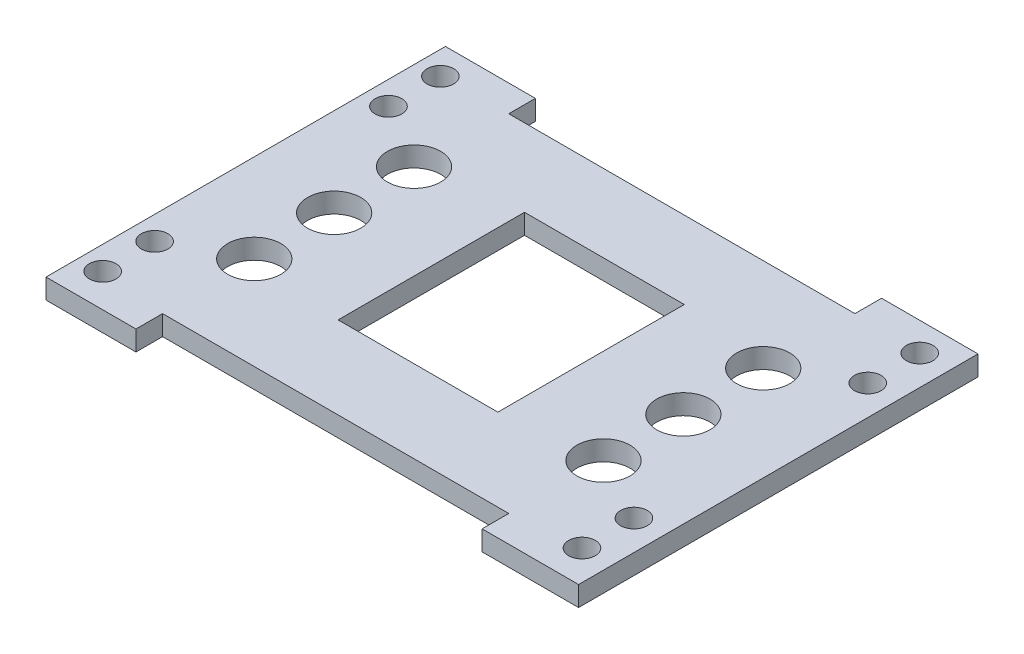
ISO-10303-21;
HEADER;
FILE_DESCRIPTION(('STEP AP214'),'2;1');
FILE_NAME('part.step','',(''),(''),'','','');
FILE_SCHEMA(('AUTOMOTIVE_DESIGN { 1 0 10303 214 1 1 1 1 }'));
ENDSEC;
DATA;
#1=APPLICATION_CONTEXT('core data for automotive mechanical design processes');
#2=APPLICATION_PROTOCOL_DEFINITION('international standard','automotive_design',2000,#1);
#3=PRODUCT_CONTEXT('',#1,'mechanical');
#4=PRODUCT('Part','Part','',(#3));
#5=PRODUCT_RELATED_PRODUCT_CATEGORY('part','',(#4));
#6=PRODUCT_DEFINITION_FORMATION('','',#4);
#7=PRODUCT_DEFINITION_CONTEXT('part definition',#1,'design');
#8=PRODUCT_DEFINITION('design','',#6,#7);
#9=PRODUCT_DEFINITION_SHAPE('','',#8);
#10=(LENGTH_UNIT() NAMED_UNIT(*) SI_UNIT(.MILLI.,.METRE.));
#11=(NAMED_UNIT(*) PLANE_ANGLE_UNIT() SI_UNIT($,.RADIAN.));
#12=(NAMED_UNIT(*) SI_UNIT($,.STERADIAN.) SOLID_ANGLE_UNIT());
#13=UNCERTAINTY_MEASURE_WITH_UNIT(LENGTH_MEASURE(1.E-05),#10,'distance_accuracy_value','');
#14=(GEOMETRIC_REPRESENTATION_CONTEXT(3) GLOBAL_UNCERTAINTY_ASSIGNED_CONTEXT((#13)) GLOBAL_UNIT_ASSIGNED_CONTEXT((#10,
#11,#12)) REPRESENTATION_CONTEXT('',''));
#15=CARTESIAN_POINT('',(0.,0.,0.));
#16=DIRECTION('',(0.,0.,1.));
#17=DIRECTION('',(1.,0.,0.));
#18=AXIS2_PLACEMENT_3D('',#15,#16,#17);
#19=CARTESIAN_POINT('',(-13.,1.5,0.));
#20=DIRECTION('',(1.,0.,0.));
#21=DIRECTION('',(0.,0.,-1.));
#22=AXIS2_PLACEMENT_3D('',#19,#20,#21);
#23=PLANE('',#22);
#24=DIRECTION('',(0.,0.,1.));
#25=VECTOR('',#24,1.);
#26=CARTESIAN_POINT('',(-13.,0.,0.));
#27=LINE('',#26,#25);
#28=CARTESIAN_POINT('',(-13.,0.,-14.8173161636122));
#29=VERTEX_POINT('',#28);
#30=CARTESIAN_POINT('',(-13.,0.,-12.8173161636123));
#31=VERTEX_POINT('',#30);
#32=EDGE_CURVE('E274',#29,#31,#27,.T.);
#33=ORIENTED_EDGE('',*,*,#32,.F.);
#34=DIRECTION('',(0.,-1.,0.));
#35=VECTOR('',#34,1.);
#36=CARTESIAN_POINT('',(-13.,1.5,-14.8173161636122));
#37=LINE('',#36,#35);
#38=CARTESIAN_POINT('',(-13.,1.5,-14.8173161636122));
#39=VERTEX_POINT('',#38);
#40=EDGE_CURVE('E11',#39,#29,#37,.T.);
#41=ORIENTED_EDGE('',*,*,#40,.F.);
#42=DIRECTION('',(0.,0.,1.));
#43=VECTOR('',#42,1.);
#44=CARTESIAN_POINT('',(-13.,1.5,0.));
#45=LINE('',#44,#43);
#46=CARTESIAN_POINT('',(-13.,1.5,-12.8173161636123));
#47=VERTEX_POINT('',#46);
#48=EDGE_CURVE('E186',#39,#47,#45,.T.);
#49=ORIENTED_EDGE('',*,*,#48,.T.);
#50=DIRECTION('',(0.,-1.,0.));
#51=VECTOR('',#50,1.);
#52=CARTESIAN_POINT('',(-13.,1.5,-12.8173161636123));
#53=LINE('',#52,#51);
#54=EDGE_CURVE('E52',#47,#31,#53,.T.);
#55=ORIENTED_EDGE('',*,*,#54,.T.);
#56=EDGE_LOOP('',(#33,#41,#49,#55));
#57=FACE_BOUND('',#56,.T.);
#58=ADVANCED_FACE('F33',(#57),#23,.T.);
#59=CARTESIAN_POINT('',(0.,1.5,-14.8173161636122));
#60=DIRECTION('',(0.,0.,-1.));
#61=DIRECTION('',(-1.,0.,0.));
#62=AXIS2_PLACEMENT_3D('',#59,#60,#61);
#63=PLANE('',#62);
#64=DIRECTION('',(1.,0.,0.));
#65=VECTOR('',#64,1.);
#66=CARTESIAN_POINT('',(0.,0.,-14.8173161636122));
#67=LINE('',#66,#65);
#68=CARTESIAN_POINT('',(-19.756421551483,0.,-14.8173161636122));
#69=VERTEX_POINT('',#68);
#70=EDGE_CURVE('E276',#69,#29,#67,.T.);
#71=ORIENTED_EDGE('',*,*,#70,.F.);
#72=DIRECTION('',(0.,-1.,0.));
#73=VECTOR('',#72,1.);
#74=CARTESIAN_POINT('',(-19.756421551483,1.5,-14.8173161636122));
#75=LINE('',#74,#73);
#76=CARTESIAN_POINT('',(-19.756421551483,1.5,-14.8173161636122));
#77=VERTEX_POINT('',#76);
#78=EDGE_CURVE('E43',#77,#69,#75,.T.);
#79=ORIENTED_EDGE('',*,*,#78,.F.);
#80=DIRECTION('',(1.,0.,0.));
#81=VECTOR('',#80,1.);
#82=CARTESIAN_POINT('',(0.,1.5,-14.8173161636122));
#83=LINE('',#82,#81);
#84=EDGE_CURVE('E179',#77,#39,#83,.T.);
#85=ORIENTED_EDGE('',*,*,#84,.T.);
#86=ORIENTED_EDGE('',*,*,#40,.T.);
#87=EDGE_LOOP('',(#71,#79,#85,#86));
#88=FACE_BOUND('',#87,.T.);
#89=ADVANCED_FACE('F350',(#88),#63,.T.);
#90=CARTESIAN_POINT('',(-19.756421551483,1.5,0.));
#91=DIRECTION('',(1.,0.,0.));
#92=DIRECTION('',(0.,0.,-1.));
#93=AXIS2_PLACEMENT_3D('',#90,#91,#92);
#94=PLANE('',#93);
#95=DIRECTION('',(0.,0.,1.));
#96=VECTOR('',#95,1.);
#97=CARTESIAN_POINT('',(-19.756421551483,0.,0.));
#98=LINE('',#97,#96);
#99=CARTESIAN_POINT('',(-19.756421551483,0.,15.1826838363877));
#100=VERTEX_POINT('',#99);
#101=EDGE_CURVE('E279',#69,#100,#98,.T.);
#102=ORIENTED_EDGE('',*,*,#101,.T.);
#103=DIRECTION('',(0.,-1.,0.));
#104=VECTOR('',#103,1.);
#105=CARTESIAN_POINT('',(-19.756421551483,1.5,15.1826838363877));
#106=LINE('',#105,#104);
#107=CARTESIAN_POINT('',(-19.756421551483,1.5,15.1826838363877));
#108=VERTEX_POINT('',#107);
#109=EDGE_CURVE('E237',#108,#100,#106,.T.);
#110=ORIENTED_EDGE('',*,*,#109,.F.);
#111=DIRECTION('',(0.,0.,1.));
#112=VECTOR('',#111,1.);
#113=CARTESIAN_POINT('',(-19.756421551483,1.5,0.));
#114=LINE('',#113,#112);
#115=EDGE_CURVE('E185',#77,#108,#114,.T.);
#116=ORIENTED_EDGE('',*,*,#115,.F.);
#117=ORIENTED_EDGE('',*,*,#78,.T.);
#118=EDGE_LOOP('',(#102,#110,#116,#117));
#119=FACE_BOUND('',#118,.T.);
#120=ADVANCED_FACE('F355',(#119),#94,.F.);
#121=CARTESIAN_POINT('',(0.,1.5,15.1826838363877));
#122=DIRECTION('',(0.,0.,-1.));
#123=DIRECTION('',(-1.,0.,0.));
#124=AXIS2_PLACEMENT_3D('',#121,#122,#123);
#125=PLANE('',#124);
#126=DIRECTION('',(1.,0.,0.));
#127=VECTOR('',#126,1.);
#128=CARTESIAN_POINT('',(0.,0.,15.1826838363877));
#129=LINE('',#128,#127);
#130=CARTESIAN_POINT('',(-13.,0.,15.1826838363877));
#131=VERTEX_POINT('',#130);
#132=EDGE_CURVE('E282',#100,#131,#129,.T.);
#133=ORIENTED_EDGE('',*,*,#132,.T.);
#134=DIRECTION('',(0.,-1.,0.));
#135=VECTOR('',#134,1.);
#136=CARTESIAN_POINT('',(-13.,1.5,15.1826838363877));
#137=LINE('',#136,#135);
#138=CARTESIAN_POINT('',(-13.,1.5,15.1826838363877));
#139=VERTEX_POINT('',#138);
#140=EDGE_CURVE('E234',#139,#131,#137,.T.);
#141=ORIENTED_EDGE('',*,*,#140,.F.);
#142=DIRECTION('',(1.,0.,0.));
#143=VECTOR('',#142,1.);
#144=CARTESIAN_POINT('',(0.,1.5,15.1826838363877));
#145=LINE('',#144,#143);
#146=EDGE_CURVE('E190',#108,#139,#145,.T.);
#147=ORIENTED_EDGE('',*,*,#146,.F.);
#148=ORIENTED_EDGE('',*,*,#109,.T.);
#149=EDGE_LOOP('',(#133,#141,#147,#148));
#150=FACE_BOUND('',#149,.T.);
#151=ADVANCED_FACE('F464',(#150),#125,.F.);
#152=CARTESIAN_POINT('',(-13.,1.5,0.));
#153=DIRECTION('',(-1.,0.,0.));
#154=DIRECTION('',(0.,0.,1.));
#155=AXIS2_PLACEMENT_3D('',#152,#153,#154);
#156=PLANE('',#155);
#157=DIRECTION('',(0.,0.,-1.));
#158=VECTOR('',#157,1.);
#159=CARTESIAN_POINT('',(-13.,0.,0.));
#160=LINE('',#159,#158);
#161=CARTESIAN_POINT('',(-13.,0.,13.1826838363877));
#162=VERTEX_POINT('',#161);
#163=EDGE_CURVE('E285',#131,#162,#160,.T.);
#164=ORIENTED_EDGE('',*,*,#163,.T.);
#165=DIRECTION('',(0.,-1.,0.));
#166=VECTOR('',#165,1.);
#167=CARTESIAN_POINT('',(-13.,1.5,13.1826838363877));
#168=LINE('',#167,#166);
#169=CARTESIAN_POINT('',(-13.,1.5,13.1826838363877));
#170=VERTEX_POINT('',#169);
#171=EDGE_CURVE('E231',#170,#162,#168,.T.);
#172=ORIENTED_EDGE('',*,*,#171,.F.);
#173=DIRECTION('',(0.,0.,-1.));
#174=VECTOR('',#173,1.);
#175=CARTESIAN_POINT('',(-13.,1.5,0.));
#176=LINE('',#175,#174);
#177=EDGE_CURVE('E428',#139,#170,#176,.T.);
#178=ORIENTED_EDGE('',*,*,#177,.F.);
#179=ORIENTED_EDGE('',*,*,#140,.T.);
#180=EDGE_LOOP('',(#164,#172,#178,#179));
#181=FACE_BOUND('',#180,.T.);
#182=ADVANCED_FACE('F470',(#181),#156,.F.);
#183=CARTESIAN_POINT('',(0.,1.5,13.1826838363877));
#184=DIRECTION('',(0.,0.,-1.));
#185=DIRECTION('',(-1.,0.,0.));
#186=AXIS2_PLACEMENT_3D('',#183,#184,#185);
#187=PLANE('',#186);
#188=DIRECTION('',(1.,0.,0.));
#189=VECTOR('',#188,1.);
#190=CARTESIAN_POINT('',(0.,0.,13.1826838363877));
#191=LINE('',#190,#189);
#192=CARTESIAN_POINT('',(13.,0.,13.1826838363877));
#193=VERTEX_POINT('',#192);
#194=EDGE_CURVE('E289',#162,#193,#191,.T.);
#195=ORIENTED_EDGE('',*,*,#194,.T.);
#196=DIRECTION('',(0.,-1.,0.));
#197=VECTOR('',#196,1.);
#198=CARTESIAN_POINT('',(13.,1.5,13.1826838363877));
#199=LINE('',#198,#197);
#200=CARTESIAN_POINT('',(13.,1.5,13.1826838363877));
#201=VERTEX_POINT('',#200);
#202=EDGE_CURVE('E229',#201,#193,#199,.T.);
#203=ORIENTED_EDGE('',*,*,#202,.F.);
#204=DIRECTION('',(1.,0.,0.));
#205=VECTOR('',#204,1.);
#206=CARTESIAN_POINT('',(0.,1.5,13.1826838363877));
#207=LINE('',#206,#205);
#208=EDGE_CURVE('E426',#170,#201,#207,.T.);
#209=ORIENTED_EDGE('',*,*,#208,.F.);
#210=ORIENTED_EDGE('',*,*,#171,.T.);
#211=EDGE_LOOP('',(#195,#203,#209,#210));
#212=FACE_BOUND('',#211,.T.);
#213=ADVANCED_FACE('F467',(#212),#187,.F.);
#214=CARTESIAN_POINT('',(13.,1.5,0.));
#215=DIRECTION('',(-1.,0.,0.));
#216=DIRECTION('',(0.,0.,1.));
#217=AXIS2_PLACEMENT_3D('',#214,#215,#216);
#218=PLANE('',#217);
#219=DIRECTION('',(0.,0.,-1.));
#220=VECTOR('',#219,1.);
#221=CARTESIAN_POINT('',(13.,0.,0.));
#222=LINE('',#221,#220);
#223=CARTESIAN_POINT('',(13.,0.,15.1826838363877));
#224=VERTEX_POINT('',#223);
#225=EDGE_CURVE('E292',#224,#193,#222,.T.);
#226=ORIENTED_EDGE('',*,*,#225,.F.);
#227=DIRECTION('',(0.,-1.,0.));
#228=VECTOR('',#227,1.);
#229=CARTESIAN_POINT('',(13.,1.5,15.1826838363877));
#230=LINE('',#229,#228);
#231=CARTESIAN_POINT('',(13.,1.5,15.1826838363877));
#232=VERTEX_POINT('',#231);
#233=EDGE_CURVE('E227',#232,#224,#230,.T.);
#234=ORIENTED_EDGE('',*,*,#233,.F.);
#235=DIRECTION('',(0.,0.,-1.));
#236=VECTOR('',#235,1.);
#237=CARTESIAN_POINT('',(13.,1.5,0.));
#238=LINE('',#237,#236);
#239=EDGE_CURVE('E423',#232,#201,#238,.T.);
#240=ORIENTED_EDGE('',*,*,#239,.T.);
#241=ORIENTED_EDGE('',*,*,#202,.T.);
#242=EDGE_LOOP('',(#226,#234,#240,#241));
#243=FACE_BOUND('',#242,.T.);
#244=ADVANCED_FACE('F463',(#243),#218,.T.);
#245=CARTESIAN_POINT('',(20.243578448517,0.,15.1826838363877));
#246=VERTEX_POINT('',#245);
#247=EDGE_CURVE('E286',#224,#246,#129,.T.);
#248=ORIENTED_EDGE('',*,*,#247,.T.);
#249=DIRECTION('',(0.,-1.,0.));
#250=VECTOR('',#249,1.);
#251=CARTESIAN_POINT('',(20.243578448517,1.5,15.1826838363877));
#252=LINE('',#251,#250);
#253=CARTESIAN_POINT('',(20.243578448517,1.5,15.1826838363877));
#254=VERTEX_POINT('',#253);
#255=EDGE_CURVE('E225',#254,#246,#252,.T.);
#256=ORIENTED_EDGE('',*,*,#255,.F.);
#257=EDGE_CURVE('E180',#232,#254,#145,.T.);
#258=ORIENTED_EDGE('',*,*,#257,.F.);
#259=ORIENTED_EDGE('',*,*,#233,.T.);
#260=EDGE_LOOP('',(#248,#256,#258,#259));
#261=FACE_BOUND('',#260,.T.);
#262=ADVANCED_FACE('F438',(#261),#125,.F.);
#263=CARTESIAN_POINT('',(20.243578448517,1.5,0.));
#264=DIRECTION('',(1.,0.,0.));
#265=DIRECTION('',(0.,0.,-1.));
#266=AXIS2_PLACEMENT_3D('',#263,#264,#265);
#267=PLANE('',#266);
#268=DIRECTION('',(0.,0.,1.));
#269=VECTOR('',#268,1.);
#270=CARTESIAN_POINT('',(20.243578448517,0.,0.));
#271=LINE('',#270,#269);
#272=CARTESIAN_POINT('',(20.243578448517,0.,-14.8173161636122));
#273=VERTEX_POINT('',#272);
#274=EDGE_CURVE('E295',#273,#246,#271,.T.);
#275=ORIENTED_EDGE('',*,*,#274,.F.);
#276=DIRECTION('',(0.,-1.,0.));
#277=VECTOR('',#276,1.);
#278=CARTESIAN_POINT('',(20.243578448517,1.5,-14.8173161636122));
#279=LINE('',#278,#277);
#280=CARTESIAN_POINT('',(20.243578448517,1.5,-14.8173161636122));
#281=VERTEX_POINT('',#280);
#282=EDGE_CURVE('E164',#281,#273,#279,.T.);
#283=ORIENTED_EDGE('',*,*,#282,.F.);
#284=DIRECTION('',(0.,0.,1.));
#285=VECTOR('',#284,1.);
#286=CARTESIAN_POINT('',(20.243578448517,1.5,0.));
#287=LINE('',#286,#285);
#288=EDGE_CURVE('E177',#281,#254,#287,.T.);
#289=ORIENTED_EDGE('',*,*,#288,.T.);
#290=ORIENTED_EDGE('',*,*,#255,.T.);
#291=EDGE_LOOP('',(#275,#283,#289,#290));
#292=FACE_BOUND('',#291,.T.);
#293=ADVANCED_FACE('F442',(#292),#267,.T.);
#294=CARTESIAN_POINT('',(13.,0.,-14.8173161636122));
#295=VERTEX_POINT('',#294);
#296=EDGE_CURVE('E161',#295,#273,#67,.T.);
#297=ORIENTED_EDGE('',*,*,#296,.F.);
#298=DIRECTION('',(0.,-1.,0.));
#299=VECTOR('',#298,1.);
#300=CARTESIAN_POINT('',(13.,1.5,-14.8173161636122));
#301=LINE('',#300,#299);
#302=CARTESIAN_POINT('',(13.,1.5,-14.8173161636122));
#303=VERTEX_POINT('',#302);
#304=EDGE_CURVE('E155',#303,#295,#301,.T.);
#305=ORIENTED_EDGE('',*,*,#304,.F.);
#306=EDGE_CURVE('E159',#303,#281,#83,.T.);
#307=ORIENTED_EDGE('',*,*,#306,.T.);
#308=ORIENTED_EDGE('',*,*,#282,.T.);
#309=EDGE_LOOP('',(#297,#305,#307,#308));
#310=FACE_BOUND('',#309,.T.);
#311=ADVANCED_FACE('F157',(#310),#63,.T.);
#312=CARTESIAN_POINT('',(13.,1.5,0.));
#313=DIRECTION('',(1.,0.,0.));
#314=DIRECTION('',(0.,0.,-1.));
#315=AXIS2_PLACEMENT_3D('',#312,#313,#314);
#316=PLANE('',#315);
#317=DIRECTION('',(0.,0.,1.));
#318=VECTOR('',#317,1.);
#319=CARTESIAN_POINT('',(13.,0.,0.));
#320=LINE('',#319,#318);
#321=CARTESIAN_POINT('',(13.,0.,-12.8173161636123));
#322=VERTEX_POINT('',#321);
#323=EDGE_CURVE('E298',#295,#322,#320,.T.);
#324=ORIENTED_EDGE('',*,*,#323,.T.);
#325=DIRECTION('',(0.,-1.,0.));
#326=VECTOR('',#325,1.);
#327=CARTESIAN_POINT('',(13.,1.5,-12.8173161636123));
#328=LINE('',#327,#326);
#329=CARTESIAN_POINT('',(13.,1.5,-12.8173161636123));
#330=VERTEX_POINT('',#329);
#331=EDGE_CURVE('E102',#330,#322,#328,.T.);
#332=ORIENTED_EDGE('',*,*,#331,.F.);
#333=DIRECTION('',(0.,0.,1.));
#334=VECTOR('',#333,1.);
#335=CARTESIAN_POINT('',(13.,1.5,0.));
#336=LINE('',#335,#334);
#337=EDGE_CURVE('E166',#303,#330,#336,.T.);
#338=ORIENTED_EDGE('',*,*,#337,.F.);
#339=ORIENTED_EDGE('',*,*,#304,.T.);
#340=EDGE_LOOP('',(#324,#332,#338,#339));
#341=FACE_BOUND('',#340,.T.);
#342=ADVANCED_FACE('F167',(#341),#316,.F.);
#343=CARTESIAN_POINT('',(0.,1.5,-7.));
#344=DIRECTION('',(0.,0.,-1.));
#345=DIRECTION('',(-1.,0.,0.));
#346=AXIS2_PLACEMENT_3D('',#343,#344,#345);
#347=PLANE('',#346);
#348=DIRECTION('',(1.,0.,0.));
#349=VECTOR('',#348,1.);
#350=CARTESIAN_POINT('',(0.,0.,-7.));
#351=LINE('',#350,#349);
#352=CARTESIAN_POINT('',(-6.,0.,-7.));
#353=VERTEX_POINT('',#352);
#354=CARTESIAN_POINT('',(6.,0.,-7.));
#355=VERTEX_POINT('',#354);
#356=EDGE_CURVE('E257',#353,#355,#351,.T.);
#357=ORIENTED_EDGE('',*,*,#356,.T.);
#358=DIRECTION('',(0.,-1.,0.));
#359=VECTOR('',#358,1.);
#360=CARTESIAN_POINT('',(6.,1.5,-7.));
#361=LINE('',#360,#359);
#362=CARTESIAN_POINT('',(6.,1.5,-7.));
#363=VERTEX_POINT('',#362);
#364=EDGE_CURVE('E37',#363,#355,#361,.T.);
#365=ORIENTED_EDGE('',*,*,#364,.F.);
#366=DIRECTION('',(1.,0.,0.));
#367=VECTOR('',#366,1.);
#368=CARTESIAN_POINT('',(0.,1.5,-7.));
#369=LINE('',#368,#367);
#370=CARTESIAN_POINT('',(-6.,1.5,-7.));
#371=VERTEX_POINT('',#370);
#372=EDGE_CURVE('E199',#371,#363,#369,.T.);
#373=ORIENTED_EDGE('',*,*,#372,.F.);
#374=DIRECTION('',(0.,-1.,0.));
#375=VECTOR('',#374,1.);
#376=CARTESIAN_POINT('',(-6.,1.5,-7.));
#377=LINE('',#376,#375);
#378=EDGE_CURVE('E241',#371,#353,#377,.T.);
#379=ORIENTED_EDGE('',*,*,#378,.T.);
#380=EDGE_LOOP('',(#357,#365,#373,#379));
#381=FACE_BOUND('',#380,.T.);
#382=ADVANCED_FACE('F258',(#381),#347,.F.);
#383=CARTESIAN_POINT('',(6.,1.5,0.));
#384=DIRECTION('',(1.,0.,0.));
#385=DIRECTION('',(0.,0.,-1.));
#386=AXIS2_PLACEMENT_3D('',#383,#384,#385);
#387=PLANE('',#386);
#388=DIRECTION('',(0.,0.,1.));
#389=VECTOR('',#388,1.);
#390=CARTESIAN_POINT('',(6.,0.,0.));
#391=LINE('',#390,#389);
#392=CARTESIAN_POINT('',(6.,0.,7.));
#393=VERTEX_POINT('',#392);
#394=EDGE_CURVE('E252',#355,#393,#391,.T.);
#395=ORIENTED_EDGE('',*,*,#394,.T.);
#396=DIRECTION('',(0.,-1.,0.));
#397=VECTOR('',#396,1.);
#398=CARTESIAN_POINT('',(6.,1.5,7.));
#399=LINE('',#398,#397);
#400=CARTESIAN_POINT('',(6.,1.5,7.));
#401=VERTEX_POINT('',#400);
#402=EDGE_CURVE('E245',#401,#393,#399,.T.);
#403=ORIENTED_EDGE('',*,*,#402,.F.);
#404=DIRECTION('',(0.,0.,1.));
#405=VECTOR('',#404,1.);
#406=CARTESIAN_POINT('',(6.,1.5,0.));
#407=LINE('',#406,#405);
#408=EDGE_CURVE('E115',#363,#401,#407,.T.);
#409=ORIENTED_EDGE('',*,*,#408,.F.);
#410=ORIENTED_EDGE('',*,*,#364,.T.);
#411=EDGE_LOOP('',(#395,#403,#409,#410));
#412=FACE_BOUND('',#411,.T.);
#413=ADVANCED_FACE('F251',(#412),#387,.F.);
#414=CARTESIAN_POINT('',(0.,1.5,7.));
#415=DIRECTION('',(0.,0.,-1.));
#416=DIRECTION('',(-1.,0.,0.));
#417=AXIS2_PLACEMENT_3D('',#414,#415,#416);
#418=PLANE('',#417);
#419=DIRECTION('',(1.,0.,0.));
#420=VECTOR('',#419,1.);
#421=CARTESIAN_POINT('',(0.,0.,7.));
#422=LINE('',#421,#420);
#423=CARTESIAN_POINT('',(-6.,0.,7.));
#424=VERTEX_POINT('',#423);
#425=EDGE_CURVE('E264',#424,#393,#422,.T.);
#426=ORIENTED_EDGE('',*,*,#425,.F.);
#427=DIRECTION('',(0.,-1.,0.));
#428=VECTOR('',#427,1.);
#429=CARTESIAN_POINT('',(-6.,1.5,7.));
#430=LINE('',#429,#428);
#431=CARTESIAN_POINT('',(-6.,1.5,7.));
#432=VERTEX_POINT('',#431);
#433=EDGE_CURVE('E243',#432,#424,#430,.T.);
#434=ORIENTED_EDGE('',*,*,#433,.F.);
#435=DIRECTION('',(1.,0.,0.));
#436=VECTOR('',#435,1.);
#437=CARTESIAN_POINT('',(0.,1.5,7.));
#438=LINE('',#437,#436);
#439=EDGE_CURVE('E193',#432,#401,#438,.T.);
#440=ORIENTED_EDGE('',*,*,#439,.T.);
#441=ORIENTED_EDGE('',*,*,#402,.T.);
#442=EDGE_LOOP('',(#426,#434,#440,#441));
#443=FACE_BOUND('',#442,.T.);
#444=ADVANCED_FACE('F345',(#443),#418,.T.);
#445=CARTESIAN_POINT('',(13.1132730822492,1.5,6.18268383638775));
#446=DIRECTION('',(0.,-1.,0.));
#447=DIRECTION('',(0.,0.,-1.));
#448=AXIS2_PLACEMENT_3D('',#445,#446,#447);
#449=CYLINDRICAL_SURFACE('',#448,2.);
#450=CARTESIAN_POINT('',(13.1132730822492,1.5,6.18268383638775));
#451=DIRECTION('',(0.,1.,0.));
#452=DIRECTION('',(0.,0.,1.));
#453=AXIS2_PLACEMENT_3D('',#450,#451,#452);
#454=CIRCLE('',#453,2.);
#455=CARTESIAN_POINT('',(13.1132730822492,1.5,8.18268383638775));
#456=VERTEX_POINT('',#455);
#457=EDGE_CURVE('E393',#456,#456,#454,.F.);
#458=ORIENTED_EDGE('',*,*,#457,.F.);
#459=EDGE_LOOP('',(#458));
#460=FACE_BOUND('',#459,.T.);
#461=CARTESIAN_POINT('',(13.1132730822492,0.,6.18268383638775));
#462=DIRECTION('',(0.,1.,0.));
#463=DIRECTION('',(0.,0.,1.));
#464=AXIS2_PLACEMENT_3D('',#461,#462,#463);
#465=CIRCLE('',#464,2.);
#466=CARTESIAN_POINT('',(13.1132730822492,0.,8.18268383638775));
#467=VERTEX_POINT('',#466);
#468=EDGE_CURVE('E213',#467,#467,#465,.F.);
#469=ORIENTED_EDGE('',*,*,#468,.T.);
#470=EDGE_LOOP('',(#469));
#471=FACE_BOUND('',#470,.T.);
#472=ADVANCED_FACE('F335',(#460,#471),#449,.F.);
#473=CARTESIAN_POINT('',(18.,1.5,-12.6826838363877));
#474=DIRECTION('',(0.,-1.,0.));
#475=DIRECTION('',(0.,0.,-1.));
#476=AXIS2_PLACEMENT_3D('',#473,#474,#475);
#477=CYLINDRICAL_SURFACE('',#476,1.);
#478=CARTESIAN_POINT('',(18.,1.5,-12.6826838363877));
#479=DIRECTION('',(0.,1.,0.));
#480=DIRECTION('',(0.,0.,1.));
#481=AXIS2_PLACEMENT_3D('',#478,#479,#480);
#482=CIRCLE('',#481,1.);
#483=CARTESIAN_POINT('',(18.,1.5,-11.6826838363877));
#484=VERTEX_POINT('',#483);
#485=EDGE_CURVE('E396',#484,#484,#482,.T.);
#486=ORIENTED_EDGE('',*,*,#485,.T.);
#487=EDGE_LOOP('',(#486));
#488=FACE_BOUND('',#487,.T.);
#489=CARTESIAN_POINT('',(18.,0.,-12.6826838363877));
#490=DIRECTION('',(0.,1.,0.));
#491=DIRECTION('',(0.,0.,1.));
#492=AXIS2_PLACEMENT_3D('',#489,#490,#491);
#493=CIRCLE('',#492,1.);
#494=CARTESIAN_POINT('',(18.,0.,-11.6826838363877));
#495=VERTEX_POINT('',#494);
#496=EDGE_CURVE('E218',#495,#495,#493,.T.);
#497=ORIENTED_EDGE('',*,*,#496,.F.);
#498=EDGE_LOOP('',(#497));
#499=FACE_BOUND('',#498,.T.);
#500=ADVANCED_FACE('F332',(#488,#499),#477,.F.);
#501=CARTESIAN_POINT('',(18.,1.5,-8.78268383638775));
#502=DIRECTION('',(0.,-1.,0.));
#503=DIRECTION('',(0.,0.,-1.));
#504=AXIS2_PLACEMENT_3D('',#501,#502,#503);
#505=CYLINDRICAL_SURFACE('',#504,1.);
#506=CARTESIAN_POINT('',(18.,1.5,-8.78268383638775));
#507=DIRECTION('',(0.,1.,0.));
#508=DIRECTION('',(0.,0.,1.));
#509=AXIS2_PLACEMENT_3D('',#506,#507,#508);
#510=CIRCLE('',#509,1.);
#511=CARTESIAN_POINT('',(18.,1.5,-7.78268383638775));
#512=VERTEX_POINT('',#511);
#513=EDGE_CURVE('E398',#512,#512,#510,.T.);
#514=ORIENTED_EDGE('',*,*,#513,.T.);
#515=EDGE_LOOP('',(#514));
#516=FACE_BOUND('',#515,.T.);
#517=CARTESIAN_POINT('',(18.,0.,-8.78268383638775));
#518=DIRECTION('',(0.,1.,0.));
#519=DIRECTION('',(0.,0.,1.));
#520=AXIS2_PLACEMENT_3D('',#517,#518,#519);
#521=CIRCLE('',#520,1.);
#522=CARTESIAN_POINT('',(18.,0.,-7.78268383638775));
#523=VERTEX_POINT('',#522);
#524=EDGE_CURVE('E324',#523,#523,#521,.T.);
#525=ORIENTED_EDGE('',*,*,#524,.F.);
#526=EDGE_LOOP('',(#525));
#527=FACE_BOUND('',#526,.T.);
#528=ADVANCED_FACE('F334',(#516,#527),#505,.F.);
#529=CARTESIAN_POINT('',(18.,1.5,12.6826838363877));
#530=DIRECTION('',(0.,-1.,0.));
#531=DIRECTION('',(0.,0.,-1.));
#532=AXIS2_PLACEMENT_3D('',#529,#530,#531);
#533=CYLINDRICAL_SURFACE('',#532,1.);
#534=CARTESIAN_POINT('',(18.,1.5,12.6826838363877));
#535=DIRECTION('',(0.,1.,0.));
#536=DIRECTION('',(0.,0.,1.));
#537=AXIS2_PLACEMENT_3D('',#534,#535,#536);
#538=CIRCLE('',#537,1.);
#539=CARTESIAN_POINT('',(18.,1.5,13.6826838363878));
#540=VERTEX_POINT('',#539);
#541=EDGE_CURVE('E401',#540,#540,#538,.F.);
#542=ORIENTED_EDGE('',*,*,#541,.F.);
#543=EDGE_LOOP('',(#542));
#544=FACE_BOUND('',#543,.T.);
#545=CARTESIAN_POINT('',(18.,0.,12.6826838363877));
#546=DIRECTION('',(0.,1.,0.));
#547=DIRECTION('',(0.,0.,1.));
#548=AXIS2_PLACEMENT_3D('',#545,#546,#547);
#549=CIRCLE('',#548,1.);
#550=CARTESIAN_POINT('',(18.,0.,13.6826838363878));
#551=VERTEX_POINT('',#550);
#552=EDGE_CURVE('E321',#551,#551,#549,.F.);
#553=ORIENTED_EDGE('',*,*,#552,.T.);
#554=EDGE_LOOP('',(#553));
#555=FACE_BOUND('',#554,.T.);
#556=ADVANCED_FACE('F342',(#544,#555),#533,.F.);
#557=CARTESIAN_POINT('',(-18.,1.5,-12.6826838363877));
#558=DIRECTION('',(0.,-1.,0.));
#559=DIRECTION('',(0.,0.,-1.));
#560=AXIS2_PLACEMENT_3D('',#557,#558,#559);
#561=CYLINDRICAL_SURFACE('',#560,1.);
#562=CARTESIAN_POINT('',(-18.,1.5,-12.6826838363877));
#563=DIRECTION('',(0.,1.,0.));
#564=DIRECTION('',(0.,0.,1.));
#565=AXIS2_PLACEMENT_3D('',#562,#563,#564);
#566=CIRCLE('',#565,1.);
#567=CARTESIAN_POINT('',(-18.,1.5,-11.6826838363877));
#568=VERTEX_POINT('',#567);
#569=EDGE_CURVE('E404',#568,#568,#566,.F.);
#570=ORIENTED_EDGE('',*,*,#569,.F.);
#571=EDGE_LOOP('',(#570));
#572=FACE_BOUND('',#571,.T.);
#573=CARTESIAN_POINT('',(-18.,0.,-12.6826838363877));
#574=DIRECTION('',(0.,1.,0.));
#575=DIRECTION('',(0.,0.,1.));
#576=AXIS2_PLACEMENT_3D('',#573,#574,#575);
#577=CIRCLE('',#576,1.);
#578=CARTESIAN_POINT('',(-18.,0.,-11.6826838363877));
#579=VERTEX_POINT('',#578);
#580=EDGE_CURVE('E318',#579,#579,#577,.F.);
#581=ORIENTED_EDGE('',*,*,#580,.T.);
#582=EDGE_LOOP('',(#581));
#583=FACE_BOUND('',#582,.T.);
#584=ADVANCED_FACE('F578',(#572,#583),#561,.F.);
#585=CARTESIAN_POINT('',(-18.,1.5,8.78268383638775));
#586=DIRECTION('',(0.,-1.,0.));
#587=DIRECTION('',(0.,0.,-1.));
#588=AXIS2_PLACEMENT_3D('',#585,#586,#587);
#589=CYLINDRICAL_SURFACE('',#588,1.);
#590=CARTESIAN_POINT('',(-18.,1.5,8.78268383638775));
#591=DIRECTION('',(0.,1.,0.));
#592=DIRECTION('',(0.,0.,1.));
#593=AXIS2_PLACEMENT_3D('',#590,#591,#592);
#594=CIRCLE('',#593,1.);
#595=CARTESIAN_POINT('',(-18.,1.5,9.78268383638775));
#596=VERTEX_POINT('',#595);
#597=EDGE_CURVE('E407',#596,#596,#594,.T.);
#598=ORIENTED_EDGE('',*,*,#597,.T.);
#599=EDGE_LOOP('',(#598));
#600=FACE_BOUND('',#599,.T.);
#601=CARTESIAN_POINT('',(-18.,0.,8.78268383638775));
#602=DIRECTION('',(0.,1.,0.));
#603=DIRECTION('',(0.,0.,1.));
#604=AXIS2_PLACEMENT_3D('',#601,#602,#603);
#605=CIRCLE('',#604,1.);
#606=CARTESIAN_POINT('',(-18.,0.,9.78268383638775));
#607=VERTEX_POINT('',#606);
#608=EDGE_CURVE('E315',#607,#607,#605,.T.);
#609=ORIENTED_EDGE('',*,*,#608,.F.);
#610=EDGE_LOOP('',(#609));
#611=FACE_BOUND('',#610,.T.);
#612=ADVANCED_FACE('F588',(#600,#611),#589,.F.);
#613=CARTESIAN_POINT('',(-18.,1.5,12.6826838363877));
#614=DIRECTION('',(0.,-1.,0.));
#615=DIRECTION('',(0.,0.,-1.));
#616=AXIS2_PLACEMENT_3D('',#613,#614,#615);
#617=CYLINDRICAL_SURFACE('',#616,1.);
#618=CARTESIAN_POINT('',(-18.,1.5,12.6826838363877));
#619=DIRECTION('',(0.,1.,0.));
#620=DIRECTION('',(0.,0.,1.));
#621=AXIS2_PLACEMENT_3D('',#618,#619,#620);
#622=CIRCLE('',#621,1.);
#623=CARTESIAN_POINT('',(-18.,1.5,13.6826838363878));
#624=VERTEX_POINT('',#623);
#625=EDGE_CURVE('E410',#624,#624,#622,.T.);
#626=ORIENTED_EDGE('',*,*,#625,.T.);
#627=EDGE_LOOP('',(#626));
#628=FACE_BOUND('',#627,.T.);
#629=CARTESIAN_POINT('',(-18.,0.,12.6826838363877));
#630=DIRECTION('',(0.,1.,0.));
#631=DIRECTION('',(0.,0.,1.));
#632=AXIS2_PLACEMENT_3D('',#629,#630,#631);
#633=CIRCLE('',#632,1.);
#634=CARTESIAN_POINT('',(-18.,0.,13.6826838363878));
#635=VERTEX_POINT('',#634);
#636=EDGE_CURVE('E312',#635,#635,#633,.T.);
#637=ORIENTED_EDGE('',*,*,#636,.F.);
#638=EDGE_LOOP('',(#637));
#639=FACE_BOUND('',#638,.T.);
#640=ADVANCED_FACE('F598',(#628,#639),#617,.F.);
#641=CARTESIAN_POINT('',(-13.1132730822492,1.5,6.18268383638775));
#642=DIRECTION('',(0.,-1.,0.));
#643=DIRECTION('',(0.,0.,-1.));
#644=AXIS2_PLACEMENT_3D('',#641,#642,#643);
#645=CYLINDRICAL_SURFACE('',#644,2.);
#646=CARTESIAN_POINT('',(-13.1132730822492,1.5,6.18268383638775));
#647=DIRECTION('',(0.,1.,0.));
#648=DIRECTION('',(0.,0.,1.));
#649=AXIS2_PLACEMENT_3D('',#646,#647,#648);
#650=CIRCLE('',#649,2.);
#651=CARTESIAN_POINT('',(-13.1132730822492,1.5,8.18268383638775));
#652=VERTEX_POINT('',#651);
#653=EDGE_CURVE('E413',#652,#652,#650,.T.);
#654=ORIENTED_EDGE('',*,*,#653,.T.);
#655=EDGE_LOOP('',(#654));
#656=FACE_BOUND('',#655,.T.);
#657=CARTESIAN_POINT('',(-13.1132730822492,0.,6.18268383638775));
#658=DIRECTION('',(0.,1.,0.));
#659=DIRECTION('',(0.,0.,1.));
#660=AXIS2_PLACEMENT_3D('',#657,#658,#659);
#661=CIRCLE('',#660,2.);
#662=CARTESIAN_POINT('',(-13.1132730822492,0.,8.18268383638775));
#663=VERTEX_POINT('',#662);
#664=EDGE_CURVE('E309',#663,#663,#661,.T.);
#665=ORIENTED_EDGE('',*,*,#664,.F.);
#666=EDGE_LOOP('',(#665));
#667=FACE_BOUND('',#666,.T.);
#668=ADVANCED_FACE('F608',(#656,#667),#645,.F.);
#669=CARTESIAN_POINT('',(-13.1132730822492,1.5,0.18268383638775));
#670=DIRECTION('',(0.,-1.,0.));
#671=DIRECTION('',(0.,0.,-1.));
#672=AXIS2_PLACEMENT_3D('',#669,#670,#671);
#673=CYLINDRICAL_SURFACE('',#672,2.);
#674=CARTESIAN_POINT('',(-13.1132730822492,1.5,0.18268383638775));
#675=DIRECTION('',(0.,1.,0.));
#676=DIRECTION('',(0.,0.,1.));
#677=AXIS2_PLACEMENT_3D('',#674,#675,#676);
#678=CIRCLE('',#677,2.);
#679=CARTESIAN_POINT('',(-13.1132730822492,1.5,2.18268383638775));
#680=VERTEX_POINT('',#679);
#681=EDGE_CURVE('E416',#680,#680,#678,.T.);
#682=ORIENTED_EDGE('',*,*,#681,.T.);
#683=EDGE_LOOP('',(#682));
#684=FACE_BOUND('',#683,.T.);
#685=CARTESIAN_POINT('',(-13.1132730822492,0.,0.18268383638775));
#686=DIRECTION('',(0.,1.,0.));
#687=DIRECTION('',(0.,0.,1.));
#688=AXIS2_PLACEMENT_3D('',#685,#686,#687);
#689=CIRCLE('',#688,2.);
#690=CARTESIAN_POINT('',(-13.1132730822492,0.,2.18268383638775));
#691=VERTEX_POINT('',#690);
#692=EDGE_CURVE('E306',#691,#691,#689,.T.);
#693=ORIENTED_EDGE('',*,*,#692,.F.);
#694=EDGE_LOOP('',(#693));
#695=FACE_BOUND('',#694,.T.);
#696=ADVANCED_FACE('F451',(#684,#695),#673,.F.);
#697=CARTESIAN_POINT('',(-13.1132730822492,1.5,-5.81731616361225));
#698=DIRECTION('',(0.,-1.,0.));
#699=DIRECTION('',(0.,0.,-1.));
#700=AXIS2_PLACEMENT_3D('',#697,#698,#699);
#701=CYLINDRICAL_SURFACE('',#700,2.);
#702=CARTESIAN_POINT('',(-13.1132730822492,1.5,-5.81731616361225));
#703=DIRECTION('',(0.,1.,0.));
#704=DIRECTION('',(0.,0.,1.));
#705=AXIS2_PLACEMENT_3D('',#702,#703,#704);
#706=CIRCLE('',#705,2.);
#707=CARTESIAN_POINT('',(-13.1132730822492,1.5,-3.81731616361225));
#708=VERTEX_POINT('',#707);
#709=EDGE_CURVE('E419',#708,#708,#706,.T.);
#710=ORIENTED_EDGE('',*,*,#709,.T.);
#711=EDGE_LOOP('',(#710));
#712=FACE_BOUND('',#711,.T.);
#713=CARTESIAN_POINT('',(-13.1132730822492,0.,-5.81731616361225));
#714=DIRECTION('',(0.,1.,0.));
#715=DIRECTION('',(0.,0.,1.));
#716=AXIS2_PLACEMENT_3D('',#713,#714,#715);
#717=CIRCLE('',#716,2.);
#718=CARTESIAN_POINT('',(-13.1132730822492,0.,-3.81731616361225));
#719=VERTEX_POINT('',#718);
#720=EDGE_CURVE('E303',#719,#719,#717,.T.);
#721=ORIENTED_EDGE('',*,*,#720,.F.);
#722=EDGE_LOOP('',(#721));
#723=FACE_BOUND('',#722,.T.);
#724=ADVANCED_FACE('F446',(#712,#723),#701,.F.);
#725=CARTESIAN_POINT('',(0.,1.5,-12.8173161636123));
#726=DIRECTION('',(0.,0.,-1.));
#727=DIRECTION('',(-1.,0.,0.));
#728=AXIS2_PLACEMENT_3D('',#725,#726,#727);
#729=PLANE('',#728);
#730=DIRECTION('',(1.,0.,0.));
#731=VECTOR('',#730,1.);
#732=CARTESIAN_POINT('',(0.,0.,-12.8173161636123));
#733=LINE('',#732,#731);
#734=EDGE_CURVE('E300',#31,#322,#733,.T.);
#735=ORIENTED_EDGE('',*,*,#734,.F.);
#736=ORIENTED_EDGE('',*,*,#54,.F.);
#737=DIRECTION('',(1.,0.,0.));
#738=VECTOR('',#737,1.);
#739=CARTESIAN_POINT('',(0.,1.5,-12.8173161636123));
#740=LINE('',#739,#738);
#741=EDGE_CURVE('E170',#47,#330,#740,.T.);
#742=ORIENTED_EDGE('',*,*,#741,.T.);
#743=ORIENTED_EDGE('',*,*,#331,.T.);
#744=EDGE_LOOP('',(#735,#736,#742,#743));
#745=FACE_BOUND('',#744,.T.);
#746=ADVANCED_FACE('F364',(#745),#729,.T.);
#747=CARTESIAN_POINT('',(-6.,1.5,0.));
#748=DIRECTION('',(1.,0.,0.));
#749=DIRECTION('',(0.,0.,-1.));
#750=AXIS2_PLACEMENT_3D('',#747,#748,#749);
#751=PLANE('',#750);
#752=DIRECTION('',(0.,0.,1.));
#753=VECTOR('',#752,1.);
#754=CARTESIAN_POINT('',(-6.,0.,0.));
#755=LINE('',#754,#753);
#756=EDGE_CURVE('E272',#353,#424,#755,.T.);
#757=ORIENTED_EDGE('',*,*,#756,.F.);
#758=ORIENTED_EDGE('',*,*,#378,.F.);
#759=DIRECTION('',(0.,0.,1.));
#760=VECTOR('',#759,1.);
#761=CARTESIAN_POINT('',(-6.,1.5,0.));
#762=LINE('',#761,#760);
#763=EDGE_CURVE('E191',#371,#432,#762,.T.);
#764=ORIENTED_EDGE('',*,*,#763,.T.);
#765=ORIENTED_EDGE('',*,*,#433,.T.);
#766=EDGE_LOOP('',(#757,#758,#764,#765));
#767=FACE_BOUND('',#766,.T.);
#768=ADVANCED_FACE('F360',(#767),#751,.T.);
#769=CARTESIAN_POINT('',(-18.,1.5,-8.78268383638775));
#770=DIRECTION('',(0.,-1.,0.));
#771=DIRECTION('',(0.,0.,-1.));
#772=AXIS2_PLACEMENT_3D('',#769,#770,#771);
#773=CYLINDRICAL_SURFACE('',#772,1.);
#774=CARTESIAN_POINT('',(-18.,1.5,-8.78268383638775));
#775=DIRECTION('',(0.,1.,0.));
#776=DIRECTION('',(0.,0.,1.));
#777=AXIS2_PLACEMENT_3D('',#774,#775,#776);
#778=CIRCLE('',#777,1.);
#779=CARTESIAN_POINT('',(-18.,1.5,-7.78268383638775));
#780=VERTEX_POINT('',#779);
#781=EDGE_CURVE('E201',#780,#780,#778,.F.);
#782=ORIENTED_EDGE('',*,*,#781,.F.);
#783=EDGE_LOOP('',(#782));
#784=FACE_BOUND('',#783,.T.);
#785=CARTESIAN_POINT('',(-18.,0.,-8.78268383638775));
#786=DIRECTION('',(0.,1.,0.));
#787=DIRECTION('',(0.,0.,1.));
#788=AXIS2_PLACEMENT_3D('',#785,#786,#787);
#789=CIRCLE('',#788,1.);
#790=CARTESIAN_POINT('',(-18.,0.,-7.78268383638775));
#791=VERTEX_POINT('',#790);
#792=EDGE_CURVE('E262',#791,#791,#789,.F.);
#793=ORIENTED_EDGE('',*,*,#792,.T.);
#794=EDGE_LOOP('',(#793));
#795=FACE_BOUND('',#794,.T.);
#796=ADVANCED_FACE('F363',(#784,#795),#773,.F.);
#797=CARTESIAN_POINT('',(18.,1.5,8.78268383638775));
#798=DIRECTION('',(0.,-1.,0.));
#799=DIRECTION('',(0.,0.,-1.));
#800=AXIS2_PLACEMENT_3D('',#797,#798,#799);
#801=CYLINDRICAL_SURFACE('',#800,1.);
#802=CARTESIAN_POINT('',(18.,1.5,8.78268383638775));
#803=DIRECTION('',(0.,1.,0.));
#804=DIRECTION('',(0.,0.,1.));
#805=AXIS2_PLACEMENT_3D('',#802,#803,#804);
#806=CIRCLE('',#805,1.);
#807=CARTESIAN_POINT('',(18.,1.5,9.78268383638775));
#808=VERTEX_POINT('',#807);
#809=EDGE_CURVE('E204',#808,#808,#806,.F.);
#810=ORIENTED_EDGE('',*,*,#809,.F.);
#811=EDGE_LOOP('',(#810));
#812=FACE_BOUND('',#811,.T.);
#813=CARTESIAN_POINT('',(18.,0.,8.78268383638775));
#814=DIRECTION('',(0.,1.,0.));
#815=DIRECTION('',(0.,0.,1.));
#816=AXIS2_PLACEMENT_3D('',#813,#814,#815);
#817=CIRCLE('',#816,1.);
#818=CARTESIAN_POINT('',(18.,0.,9.78268383638775));
#819=VERTEX_POINT('',#818);
#820=EDGE_CURVE('E267',#819,#819,#817,.F.);
#821=ORIENTED_EDGE('',*,*,#820,.T.);
#822=EDGE_LOOP('',(#821));
#823=FACE_BOUND('',#822,.T.);
#824=ADVANCED_FACE('F373',(#812,#823),#801,.F.);
#825=CARTESIAN_POINT('',(13.1132730822492,1.5,0.18268383638775));
#826=DIRECTION('',(0.,-1.,0.));
#827=DIRECTION('',(0.,0.,-1.));
#828=AXIS2_PLACEMENT_3D('',#825,#826,#827);
#829=CYLINDRICAL_SURFACE('',#828,2.);
#830=CARTESIAN_POINT('',(13.1132730822492,1.5,0.18268383638775));
#831=DIRECTION('',(0.,1.,0.));
#832=DIRECTION('',(0.,0.,1.));
#833=AXIS2_PLACEMENT_3D('',#830,#831,#832);
#834=CIRCLE('',#833,2.);
#835=CARTESIAN_POINT('',(13.1132730822492,1.5,2.18268383638775));
#836=VERTEX_POINT('',#835);
#837=EDGE_CURVE('E207',#836,#836,#834,.F.);
#838=ORIENTED_EDGE('',*,*,#837,.F.);
#839=EDGE_LOOP('',(#838));
#840=FACE_BOUND('',#839,.T.);
#841=CARTESIAN_POINT('',(13.1132730822492,0.,0.18268383638775));
#842=DIRECTION('',(0.,1.,0.));
#843=DIRECTION('',(0.,0.,1.));
#844=AXIS2_PLACEMENT_3D('',#841,#842,#843);
#845=CIRCLE('',#844,2.);
#846=CARTESIAN_POINT('',(13.1132730822492,0.,2.18268383638775));
#847=VERTEX_POINT('',#846);
#848=EDGE_CURVE('E387',#847,#847,#845,.F.);
#849=ORIENTED_EDGE('',*,*,#848,.T.);
#850=EDGE_LOOP('',(#849));
#851=FACE_BOUND('',#850,.T.);
#852=ADVANCED_FACE('F35',(#840,#851),#829,.F.);
#853=CARTESIAN_POINT('',(13.1132730822492,1.5,-5.81731616361225));
#854=DIRECTION('',(0.,-1.,0.));
#855=DIRECTION('',(0.,0.,-1.));
#856=AXIS2_PLACEMENT_3D('',#853,#854,#855);
#857=CYLINDRICAL_SURFACE('',#856,2.);
#858=CARTESIAN_POINT('',(13.1132730822492,1.5,-5.81731616361225));
#859=DIRECTION('',(0.,1.,0.));
#860=DIRECTION('',(0.,0.,1.));
#861=AXIS2_PLACEMENT_3D('',#858,#859,#860);
#862=CIRCLE('',#861,2.);
#863=CARTESIAN_POINT('',(13.1132730822492,1.5,-3.81731616361225));
#864=VERTEX_POINT('',#863);
#865=EDGE_CURVE('E244',#864,#864,#862,.F.);
#866=ORIENTED_EDGE('',*,*,#865,.F.);
#867=EDGE_LOOP('',(#866));
#868=FACE_BOUND('',#867,.T.);
#869=CARTESIAN_POINT('',(13.1132730822492,0.,-5.81731616361225));
#870=DIRECTION('',(0.,1.,0.));
#871=DIRECTION('',(0.,0.,1.));
#872=AXIS2_PLACEMENT_3D('',#869,#870,#871);
#873=CIRCLE('',#872,2.);
#874=CARTESIAN_POINT('',(13.1132730822492,0.,-3.81731616361225));
#875=VERTEX_POINT('',#874);
#876=EDGE_CURVE('E209',#875,#875,#873,.F.);
#877=ORIENTED_EDGE('',*,*,#876,.T.);
#878=EDGE_LOOP('',(#877));
#879=FACE_BOUND('',#878,.T.);
#880=ADVANCED_FACE('F380',(#868,#879),#857,.F.);
#881=CARTESIAN_POINT('',(0.,1.5,0.));
#882=DIRECTION('',(0.,1.,0.));
#883=DIRECTION('',(0.,0.,1.));
#884=AXIS2_PLACEMENT_3D('',#881,#882,#883);
#885=PLANE('',#884);
#886=ORIENTED_EDGE('',*,*,#837,.T.);
#887=EDGE_LOOP('',(#886));
#888=FACE_BOUND('',#887,.T.);
#889=ORIENTED_EDGE('',*,*,#809,.T.);
#890=EDGE_LOOP('',(#889));
#891=FACE_BOUND('',#890,.T.);
#892=ORIENTED_EDGE('',*,*,#781,.T.);
#893=EDGE_LOOP('',(#892));
#894=FACE_BOUND('',#893,.T.);
#895=ORIENTED_EDGE('',*,*,#372,.T.);
#896=ORIENTED_EDGE('',*,*,#408,.T.);
#897=ORIENTED_EDGE('',*,*,#439,.F.);
#898=ORIENTED_EDGE('',*,*,#763,.F.);
#899=EDGE_LOOP('',(#895,#896,#897,#898));
#900=FACE_BOUND('',#899,.T.);
#901=ORIENTED_EDGE('',*,*,#48,.F.);
#902=ORIENTED_EDGE('',*,*,#84,.F.);
#903=ORIENTED_EDGE('',*,*,#115,.T.);
#904=ORIENTED_EDGE('',*,*,#146,.T.);
#905=ORIENTED_EDGE('',*,*,#177,.T.);
#906=ORIENTED_EDGE('',*,*,#208,.T.);
#907=ORIENTED_EDGE('',*,*,#239,.F.);
#908=ORIENTED_EDGE('',*,*,#257,.T.);
#909=ORIENTED_EDGE('',*,*,#288,.F.);
#910=ORIENTED_EDGE('',*,*,#306,.F.);
#911=ORIENTED_EDGE('',*,*,#337,.T.);
#912=ORIENTED_EDGE('',*,*,#741,.F.);
#913=EDGE_LOOP('',(#901,#902,#903,#904,#905,#906,#907,#908,#909,#910,#911,#912));
#914=FACE_BOUND('',#913,.T.);
#915=ORIENTED_EDGE('',*,*,#709,.F.);
#916=EDGE_LOOP('',(#915));
#917=FACE_BOUND('',#916,.T.);
#918=ORIENTED_EDGE('',*,*,#681,.F.);
#919=EDGE_LOOP('',(#918));
#920=FACE_BOUND('',#919,.T.);
#921=ORIENTED_EDGE('',*,*,#653,.F.);
#922=EDGE_LOOP('',(#921));
#923=FACE_BOUND('',#922,.T.);
#924=ORIENTED_EDGE('',*,*,#625,.F.);
#925=EDGE_LOOP('',(#924));
#926=FACE_BOUND('',#925,.T.);
#927=ORIENTED_EDGE('',*,*,#597,.F.);
#928=EDGE_LOOP('',(#927));
#929=FACE_BOUND('',#928,.T.);
#930=ORIENTED_EDGE('',*,*,#569,.T.);
#931=EDGE_LOOP('',(#930));
#932=FACE_BOUND('',#931,.T.);
#933=ORIENTED_EDGE('',*,*,#541,.T.);
#934=EDGE_LOOP('',(#933));
#935=FACE_BOUND('',#934,.T.);
#936=ORIENTED_EDGE('',*,*,#513,.F.);
#937=EDGE_LOOP('',(#936));
#938=FACE_BOUND('',#937,.T.);
#939=ORIENTED_EDGE('',*,*,#485,.F.);
#940=EDGE_LOOP('',(#939));
#941=FACE_BOUND('',#940,.T.);
#942=ORIENTED_EDGE('',*,*,#457,.T.);
#943=EDGE_LOOP('',(#942));
#944=FACE_BOUND('',#943,.T.);
#945=ORIENTED_EDGE('',*,*,#865,.T.);
#946=EDGE_LOOP('',(#945));
#947=FACE_BOUND('',#946,.T.);
#948=ADVANCED_FACE('F174',(#888,#891,#894,#900,#914,#917,#920,#923,#926,#929,#932,#935,#938,
#941,#944,#947),#885,.T.);
#949=CARTESIAN_POINT('',(0.,0.,0.));
#950=DIRECTION('',(0.,1.,0.));
#951=DIRECTION('',(0.,0.,1.));
#952=AXIS2_PLACEMENT_3D('',#949,#950,#951);
#953=PLANE('',#952);
#954=ORIENTED_EDGE('',*,*,#848,.F.);
#955=EDGE_LOOP('',(#954));
#956=FACE_BOUND('',#955,.T.);
#957=ORIENTED_EDGE('',*,*,#820,.F.);
#958=EDGE_LOOP('',(#957));
#959=FACE_BOUND('',#958,.T.);
#960=ORIENTED_EDGE('',*,*,#792,.F.);
#961=EDGE_LOOP('',(#960));
#962=FACE_BOUND('',#961,.T.);
#963=ORIENTED_EDGE('',*,*,#356,.F.);
#964=ORIENTED_EDGE('',*,*,#756,.T.);
#965=ORIENTED_EDGE('',*,*,#425,.T.);
#966=ORIENTED_EDGE('',*,*,#394,.F.);
#967=EDGE_LOOP('',(#963,#964,#965,#966));
#968=FACE_BOUND('',#967,.T.);
#969=ORIENTED_EDGE('',*,*,#32,.T.);
#970=ORIENTED_EDGE('',*,*,#734,.T.);
#971=ORIENTED_EDGE('',*,*,#323,.F.);
#972=ORIENTED_EDGE('',*,*,#296,.T.);
#973=ORIENTED_EDGE('',*,*,#274,.T.);
#974=ORIENTED_EDGE('',*,*,#247,.F.);
#975=ORIENTED_EDGE('',*,*,#225,.T.);
#976=ORIENTED_EDGE('',*,*,#194,.F.);
#977=ORIENTED_EDGE('',*,*,#163,.F.);
#978=ORIENTED_EDGE('',*,*,#132,.F.);
#979=ORIENTED_EDGE('',*,*,#101,.F.);
#980=ORIENTED_EDGE('',*,*,#70,.T.);
#981=EDGE_LOOP('',(#969,#970,#971,#972,#973,#974,#975,#976,#977,#978,#979,#980));
#982=FACE_BOUND('',#981,.T.);
#983=ORIENTED_EDGE('',*,*,#720,.T.);
#984=EDGE_LOOP('',(#983));
#985=FACE_BOUND('',#984,.T.);
#986=ORIENTED_EDGE('',*,*,#692,.T.);
#987=EDGE_LOOP('',(#986));
#988=FACE_BOUND('',#987,.T.);
#989=ORIENTED_EDGE('',*,*,#664,.T.);
#990=EDGE_LOOP('',(#989));
#991=FACE_BOUND('',#990,.T.);
#992=ORIENTED_EDGE('',*,*,#636,.T.);
#993=EDGE_LOOP('',(#992));
#994=FACE_BOUND('',#993,.T.);
#995=ORIENTED_EDGE('',*,*,#608,.T.);
#996=EDGE_LOOP('',(#995));
#997=FACE_BOUND('',#996,.T.);
#998=ORIENTED_EDGE('',*,*,#580,.F.);
#999=EDGE_LOOP('',(#998));
#1000=FACE_BOUND('',#999,.T.);
#1001=ORIENTED_EDGE('',*,*,#552,.F.);
#1002=EDGE_LOOP('',(#1001));
#1003=FACE_BOUND('',#1002,.T.);
#1004=ORIENTED_EDGE('',*,*,#524,.T.);
#1005=EDGE_LOOP('',(#1004));
#1006=FACE_BOUND('',#1005,.T.);
#1007=ORIENTED_EDGE('',*,*,#496,.T.);
#1008=EDGE_LOOP('',(#1007));
#1009=FACE_BOUND('',#1008,.T.);
#1010=ORIENTED_EDGE('',*,*,#468,.F.);
#1011=EDGE_LOOP('',(#1010));
#1012=FACE_BOUND('',#1011,.T.);
#1013=ORIENTED_EDGE('',*,*,#876,.F.);
#1014=EDGE_LOOP('',(#1013));
#1015=FACE_BOUND('',#1014,.T.);
#1016=ADVANCED_FACE('F329',(#956,#959,#962,#968,#982,#985,#988,#991,#994,#997,#1000,#1003,#1006,
#1009,#1012,#1015),#953,.F.);
#1017=CLOSED_SHELL('',(#58,#89,#120,#151,#182,#213,#244,#262,#293,#311,#342,#382,#413,#444,#472,
#500,#528,#556,#584,#612,#640,#668,#696,#724,#746,#768,#796,#824,#852,#880,#948,#1016));
#1018=MANIFOLD_SOLID_BREP('B2',#1017);
#1019=ADVANCED_BREP_SHAPE_REPRESENTATION('',(#18,#1018),#14);
#1020=SHAPE_DEFINITION_REPRESENTATION(#9,#1019);
ENDSEC;
END-ISO-10303-21;
